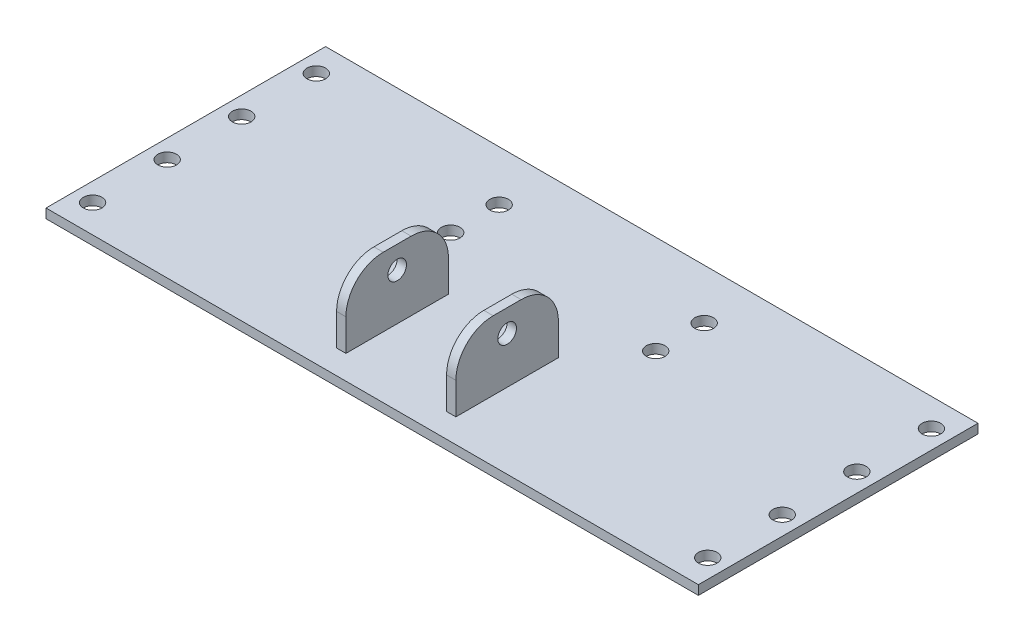
ISO-10303-21;
HEADER;
FILE_DESCRIPTION(('STEP AP214'),'2;1');
FILE_NAME('part.step','',(''),(''),'','','');
FILE_SCHEMA(('AUTOMOTIVE_DESIGN { 1 0 10303 214 1 1 1 1 }'));
ENDSEC;
DATA;
#1=APPLICATION_CONTEXT('core data for automotive mechanical design processes');
#2=APPLICATION_PROTOCOL_DEFINITION('international standard','automotive_design',2000,#1);
#3=PRODUCT_CONTEXT('',#1,'mechanical');
#4=PRODUCT('Part','Part','',(#3));
#5=PRODUCT_RELATED_PRODUCT_CATEGORY('part','',(#4));
#6=PRODUCT_DEFINITION_FORMATION('','',#4);
#7=PRODUCT_DEFINITION_CONTEXT('part definition',#1,'design');
#8=PRODUCT_DEFINITION('design','',#6,#7);
#9=PRODUCT_DEFINITION_SHAPE('','',#8);
#10=(LENGTH_UNIT() NAMED_UNIT(*) SI_UNIT(.MILLI.,.METRE.));
#11=(NAMED_UNIT(*) PLANE_ANGLE_UNIT() SI_UNIT($,.RADIAN.));
#12=(NAMED_UNIT(*) SI_UNIT($,.STERADIAN.) SOLID_ANGLE_UNIT());
#13=UNCERTAINTY_MEASURE_WITH_UNIT(LENGTH_MEASURE(1.E-05),#10,'distance_accuracy_value','');
#14=(GEOMETRIC_REPRESENTATION_CONTEXT(3) GLOBAL_UNCERTAINTY_ASSIGNED_CONTEXT((#13)) GLOBAL_UNIT_ASSIGNED_CONTEXT((#10,
#11,#12)) REPRESENTATION_CONTEXT('',''));
#15=CARTESIAN_POINT('',(0.,0.,0.));
#16=DIRECTION('',(0.,0.,1.));
#17=DIRECTION('',(1.,0.,0.));
#18=AXIS2_PLACEMENT_3D('',#15,#16,#17);
#19=CARTESIAN_POINT('',(0.,5.,0.));
#20=DIRECTION('',(0.,-1.,0.));
#21=DIRECTION('',(0.,0.,-1.));
#22=AXIS2_PLACEMENT_3D('',#19,#20,#21);
#23=PLANE('',#22);
#24=CARTESIAN_POINT('',(165.,5.,-60.));
#25=DIRECTION('',(0.,-1.,0.));
#26=DIRECTION('',(0.,0.,1.));
#27=AXIS2_PLACEMENT_3D('',#24,#25,#26);
#28=CIRCLE('',#27,5.00000000000002);
#29=CARTESIAN_POINT('',(165.,5.,-55.));
#30=VERTEX_POINT('',#29);
#31=EDGE_CURVE('E437',#30,#30,#28,.T.);
#32=ORIENTED_EDGE('',*,*,#31,.T.);
#33=EDGE_LOOP('',(#32));
#34=FACE_BOUND('',#33,.T.);
#35=CARTESIAN_POINT('',(165.,5.,-20.));
#36=DIRECTION('',(0.,-1.,0.));
#37=DIRECTION('',(0.,0.,1.));
#38=AXIS2_PLACEMENT_3D('',#35,#36,#37);
#39=CIRCLE('',#38,4.99999999999999);
#40=CARTESIAN_POINT('',(165.,5.,-15.0000000000001));
#41=VERTEX_POINT('',#40);
#42=EDGE_CURVE('E429',#41,#41,#39,.T.);
#43=ORIENTED_EDGE('',*,*,#42,.T.);
#44=EDGE_LOOP('',(#43));
#45=FACE_BOUND('',#44,.T.);
#46=CARTESIAN_POINT('',(165.,5.,20.));
#47=DIRECTION('',(0.,-1.,0.));
#48=DIRECTION('',(0.,0.,1.));
#49=AXIS2_PLACEMENT_3D('',#46,#47,#48);
#50=CIRCLE('',#49,4.99999999999999);
#51=CARTESIAN_POINT('',(165.,5.,25.));
#52=VERTEX_POINT('',#51);
#53=EDGE_CURVE('E421',#52,#52,#50,.T.);
#54=ORIENTED_EDGE('',*,*,#53,.T.);
#55=EDGE_LOOP('',(#54));
#56=FACE_BOUND('',#55,.T.);
#57=CARTESIAN_POINT('',(165.,5.,60.));
#58=DIRECTION('',(0.,-1.,0.));
#59=DIRECTION('',(0.,0.,1.));
#60=AXIS2_PLACEMENT_3D('',#57,#58,#59);
#61=CIRCLE('',#60,5.00000000000002);
#62=CARTESIAN_POINT('',(165.,5.,65.));
#63=VERTEX_POINT('',#62);
#64=EDGE_CURVE('E413',#63,#63,#61,.T.);
#65=ORIENTED_EDGE('',*,*,#64,.T.);
#66=EDGE_LOOP('',(#65));
#67=FACE_BOUND('',#66,.T.);
#68=CARTESIAN_POINT('',(-165.,5.,-60.));
#69=DIRECTION('',(0.,1.,0.));
#70=DIRECTION('',(0.,0.,1.));
#71=AXIS2_PLACEMENT_3D('',#68,#69,#70);
#72=CIRCLE('',#71,5.00000000000002);
#73=CARTESIAN_POINT('',(-165.,5.,-55.));
#74=VERTEX_POINT('',#73);
#75=EDGE_CURVE('E406',#74,#74,#72,.T.);
#76=ORIENTED_EDGE('',*,*,#75,.F.);
#77=EDGE_LOOP('',(#76));
#78=FACE_BOUND('',#77,.T.);
#79=CARTESIAN_POINT('',(-165.,5.,-20.));
#80=DIRECTION('',(0.,1.,0.));
#81=DIRECTION('',(0.,0.,1.));
#82=AXIS2_PLACEMENT_3D('',#79,#80,#81);
#83=CIRCLE('',#82,4.99999999999999);
#84=CARTESIAN_POINT('',(-165.,5.,-15.0000000000001));
#85=VERTEX_POINT('',#84);
#86=EDGE_CURVE('E398',#85,#85,#83,.T.);
#87=ORIENTED_EDGE('',*,*,#86,.F.);
#88=EDGE_LOOP('',(#87));
#89=FACE_BOUND('',#88,.T.);
#90=CARTESIAN_POINT('',(-165.,5.,20.));
#91=DIRECTION('',(0.,1.,0.));
#92=DIRECTION('',(0.,0.,1.));
#93=AXIS2_PLACEMENT_3D('',#90,#91,#92);
#94=CIRCLE('',#93,4.99999999999999);
#95=CARTESIAN_POINT('',(-165.,5.,25.));
#96=VERTEX_POINT('',#95);
#97=EDGE_CURVE('E390',#96,#96,#94,.T.);
#98=ORIENTED_EDGE('',*,*,#97,.F.);
#99=EDGE_LOOP('',(#98));
#100=FACE_BOUND('',#99,.T.);
#101=CARTESIAN_POINT('',(-165.,5.,60.));
#102=DIRECTION('',(0.,1.,0.));
#103=DIRECTION('',(0.,0.,1.));
#104=AXIS2_PLACEMENT_3D('',#101,#102,#103);
#105=CIRCLE('',#104,5.00000000000002);
#106=CARTESIAN_POINT('',(-165.,5.,65.));
#107=VERTEX_POINT('',#106);
#108=EDGE_CURVE('E381',#107,#107,#105,.T.);
#109=ORIENTED_EDGE('',*,*,#108,.F.);
#110=EDGE_LOOP('',(#109));
#111=FACE_BOUND('',#110,.T.);
#112=CARTESIAN_POINT('',(55.,5.,-48.1));
#113=DIRECTION('',(0.,-1.,0.));
#114=DIRECTION('',(0.,0.,1.));
#115=AXIS2_PLACEMENT_3D('',#112,#113,#114);
#116=CIRCLE('',#115,5.);
#117=CARTESIAN_POINT('',(55.,5.,-43.1));
#118=VERTEX_POINT('',#117);
#119=EDGE_CURVE('E374',#118,#118,#116,.T.);
#120=ORIENTED_EDGE('',*,*,#119,.T.);
#121=EDGE_LOOP('',(#120));
#122=FACE_BOUND('',#121,.T.);
#123=CARTESIAN_POINT('',(55.,5.,-22.1));
#124=DIRECTION('',(0.,-1.,0.));
#125=DIRECTION('',(0.,0.,1.));
#126=AXIS2_PLACEMENT_3D('',#123,#124,#125);
#127=CIRCLE('',#126,5.);
#128=CARTESIAN_POINT('',(55.,5.,-17.1));
#129=VERTEX_POINT('',#128);
#130=EDGE_CURVE('E365',#129,#129,#127,.T.);
#131=ORIENTED_EDGE('',*,*,#130,.T.);
#132=EDGE_LOOP('',(#131));
#133=FACE_BOUND('',#132,.T.);
#134=CARTESIAN_POINT('',(-55.,5.,-48.1));
#135=DIRECTION('',(0.,1.,0.));
#136=DIRECTION('',(0.,0.,1.));
#137=AXIS2_PLACEMENT_3D('',#134,#135,#136);
#138=CIRCLE('',#137,5.);
#139=CARTESIAN_POINT('',(-55.,5.,-43.1));
#140=VERTEX_POINT('',#139);
#141=EDGE_CURVE('E358',#140,#140,#138,.T.);
#142=ORIENTED_EDGE('',*,*,#141,.F.);
#143=EDGE_LOOP('',(#142));
#144=FACE_BOUND('',#143,.T.);
#145=CARTESIAN_POINT('',(-55.,5.,-22.1));
#146=DIRECTION('',(0.,1.,0.));
#147=DIRECTION('',(0.,0.,1.));
#148=AXIS2_PLACEMENT_3D('',#145,#146,#147);
#149=CIRCLE('',#148,5.);
#150=CARTESIAN_POINT('',(-55.,5.,-17.1));
#151=VERTEX_POINT('',#150);
#152=EDGE_CURVE('E349',#151,#151,#149,.T.);
#153=ORIENTED_EDGE('',*,*,#152,.F.);
#154=EDGE_LOOP('',(#153));
#155=FACE_BOUND('',#154,.T.);
#156=DIRECTION('',(0.,0.,-1.));
#157=VECTOR('',#156,1.);
#158=CARTESIAN_POINT('',(32.,5.,0.));
#159=LINE('',#158,#157);
#160=CARTESIAN_POINT('',(32.,5.,62.1));
#161=VERTEX_POINT('',#160);
#162=CARTESIAN_POINT('',(32.,5.,7.09999999999997));
#163=VERTEX_POINT('',#162);
#164=EDGE_CURVE('E219',#161,#163,#159,.T.);
#165=ORIENTED_EDGE('',*,*,#164,.F.);
#166=DIRECTION('',(1.,0.,0.));
#167=VECTOR('',#166,1.);
#168=CARTESIAN_POINT('',(0.,5.,62.1));
#169=LINE('',#168,#167);
#170=CARTESIAN_POINT('',(27.,5.,62.1));
#171=VERTEX_POINT('',#170);
#172=EDGE_CURVE('E226',#171,#161,#169,.T.);
#173=ORIENTED_EDGE('',*,*,#172,.F.);
#174=DIRECTION('',(0.,0.,-1.));
#175=VECTOR('',#174,1.);
#176=CARTESIAN_POINT('',(27.,5.,0.));
#177=LINE('',#176,#175);
#178=CARTESIAN_POINT('',(27.,5.,7.09999999999997));
#179=VERTEX_POINT('',#178);
#180=EDGE_CURVE('E205',#171,#179,#177,.T.);
#181=ORIENTED_EDGE('',*,*,#180,.T.);
#182=DIRECTION('',(-1.,0.,0.));
#183=VECTOR('',#182,1.);
#184=CARTESIAN_POINT('',(0.,5.,7.09999999999997));
#185=LINE('',#184,#183);
#186=EDGE_CURVE('E222',#163,#179,#185,.T.);
#187=ORIENTED_EDGE('',*,*,#186,.F.);
#188=EDGE_LOOP('',(#165,#173,#181,#187));
#189=FACE_BOUND('',#188,.T.);
#190=DIRECTION('',(0.,0.,1.));
#191=VECTOR('',#190,1.);
#192=CARTESIAN_POINT('',(-175.,5.,-75.));
#193=LINE('',#192,#191);
#194=CARTESIAN_POINT('',(-175.,5.,-75.));
#195=VERTEX_POINT('',#194);
#196=CARTESIAN_POINT('',(-175.,5.,75.));
#197=VERTEX_POINT('',#196);
#198=EDGE_CURVE('E231',#195,#197,#193,.T.);
#199=ORIENTED_EDGE('',*,*,#198,.T.);
#200=DIRECTION('',(1.,0.,0.));
#201=VECTOR('',#200,1.);
#202=CARTESIAN_POINT('',(175.,5.,75.));
#203=LINE('',#202,#201);
#204=CARTESIAN_POINT('',(175.,5.,75.));
#205=VERTEX_POINT('',#204);
#206=EDGE_CURVE('E235',#197,#205,#203,.T.);
#207=ORIENTED_EDGE('',*,*,#206,.T.);
#208=DIRECTION('',(0.,0.,-1.));
#209=VECTOR('',#208,1.);
#210=CARTESIAN_POINT('',(175.,5.,-75.));
#211=LINE('',#210,#209);
#212=CARTESIAN_POINT('',(175.,5.,-75.));
#213=VERTEX_POINT('',#212);
#214=EDGE_CURVE('E239',#205,#213,#211,.T.);
#215=ORIENTED_EDGE('',*,*,#214,.T.);
#216=DIRECTION('',(-1.,0.,0.));
#217=VECTOR('',#216,1.);
#218=CARTESIAN_POINT('',(175.,5.,-75.));
#219=LINE('',#218,#217);
#220=EDGE_CURVE('E242',#213,#195,#219,.T.);
#221=ORIENTED_EDGE('',*,*,#220,.T.);
#222=EDGE_LOOP('',(#199,#207,#215,#221));
#223=FACE_BOUND('',#222,.T.);
#224=DIRECTION('',(0.,0.,1.));
#225=VECTOR('',#224,1.);
#226=CARTESIAN_POINT('',(-32.,5.,0.));
#227=LINE('',#226,#225);
#228=CARTESIAN_POINT('',(-32.,5.,7.09999999999997));
#229=VERTEX_POINT('',#228);
#230=CARTESIAN_POINT('',(-32.,5.,62.1));
#231=VERTEX_POINT('',#230);
#232=EDGE_CURVE('E163',#229,#231,#227,.T.);
#233=ORIENTED_EDGE('',*,*,#232,.F.);
#234=DIRECTION('',(1.,0.,0.));
#235=VECTOR('',#234,1.);
#236=CARTESIAN_POINT('',(0.,5.,7.09999999999997));
#237=LINE('',#236,#235);
#238=CARTESIAN_POINT('',(-27.,5.,7.09999999999997));
#239=VERTEX_POINT('',#238);
#240=EDGE_CURVE('E170',#229,#239,#237,.T.);
#241=ORIENTED_EDGE('',*,*,#240,.T.);
#242=DIRECTION('',(0.,0.,1.));
#243=VECTOR('',#242,1.);
#244=CARTESIAN_POINT('',(-27.,5.,0.));
#245=LINE('',#244,#243);
#246=CARTESIAN_POINT('',(-27.,5.,62.1));
#247=VERTEX_POINT('',#246);
#248=EDGE_CURVE('E153',#239,#247,#245,.T.);
#249=ORIENTED_EDGE('',*,*,#248,.T.);
#250=DIRECTION('',(-1.,0.,0.));
#251=VECTOR('',#250,1.);
#252=CARTESIAN_POINT('',(0.,5.,62.1));
#253=LINE('',#252,#251);
#254=EDGE_CURVE('E181',#247,#231,#253,.T.);
#255=ORIENTED_EDGE('',*,*,#254,.T.);
#256=EDGE_LOOP('',(#233,#241,#249,#255));
#257=FACE_BOUND('',#256,.T.);
#258=ADVANCED_FACE('F39',(#34,#45,#56,#67,#78,#89,#100,#111,#122,#133,#144,#155,#189,#223,#257),
#23,.F.);
#259=CARTESIAN_POINT('',(-175.,5.,-75.));
#260=DIRECTION('',(1.,0.,0.));
#261=DIRECTION('',(0.,0.,-1.));
#262=AXIS2_PLACEMENT_3D('',#259,#260,#261);
#263=PLANE('',#262);
#264=DIRECTION('',(0.,0.,1.));
#265=VECTOR('',#264,1.);
#266=CARTESIAN_POINT('',(-175.,0.,-75.));
#267=LINE('',#266,#265);
#268=CARTESIAN_POINT('',(-175.,0.,-75.));
#269=VERTEX_POINT('',#268);
#270=CARTESIAN_POINT('',(-175.,0.,75.));
#271=VERTEX_POINT('',#270);
#272=EDGE_CURVE('E230',#269,#271,#267,.T.);
#273=ORIENTED_EDGE('',*,*,#272,.T.);
#274=DIRECTION('',(0.,-1.,0.));
#275=VECTOR('',#274,1.);
#276=CARTESIAN_POINT('',(-175.,5.,75.));
#277=LINE('',#276,#275);
#278=EDGE_CURVE('E268',#197,#271,#277,.T.);
#279=ORIENTED_EDGE('',*,*,#278,.F.);
#280=ORIENTED_EDGE('',*,*,#198,.F.);
#281=DIRECTION('',(0.,-1.,0.));
#282=VECTOR('',#281,1.);
#283=CARTESIAN_POINT('',(-175.,5.,-75.));
#284=LINE('',#283,#282);
#285=EDGE_CURVE('E245',#195,#269,#284,.T.);
#286=ORIENTED_EDGE('',*,*,#285,.T.);
#287=EDGE_LOOP('',(#273,#279,#280,#286));
#288=FACE_BOUND('',#287,.T.);
#289=ADVANCED_FACE('F481',(#288),#263,.F.);
#290=CARTESIAN_POINT('',(175.,5.,75.));
#291=DIRECTION('',(0.,0.,-1.));
#292=DIRECTION('',(-1.,0.,0.));
#293=AXIS2_PLACEMENT_3D('',#290,#291,#292);
#294=PLANE('',#293);
#295=DIRECTION('',(1.,0.,0.));
#296=VECTOR('',#295,1.);
#297=CARTESIAN_POINT('',(175.,0.,75.));
#298=LINE('',#297,#296);
#299=CARTESIAN_POINT('',(175.,0.,75.));
#300=VERTEX_POINT('',#299);
#301=EDGE_CURVE('E249',#271,#300,#298,.T.);
#302=ORIENTED_EDGE('',*,*,#301,.T.);
#303=DIRECTION('',(0.,-1.,0.));
#304=VECTOR('',#303,1.);
#305=CARTESIAN_POINT('',(175.,5.,75.));
#306=LINE('',#305,#304);
#307=EDGE_CURVE('E264',#205,#300,#306,.T.);
#308=ORIENTED_EDGE('',*,*,#307,.F.);
#309=ORIENTED_EDGE('',*,*,#206,.F.);
#310=ORIENTED_EDGE('',*,*,#278,.T.);
#311=EDGE_LOOP('',(#302,#308,#309,#310));
#312=FACE_BOUND('',#311,.T.);
#313=ADVANCED_FACE('F492',(#312),#294,.F.);
#314=CARTESIAN_POINT('',(175.,5.,-75.));
#315=DIRECTION('',(-1.,0.,0.));
#316=DIRECTION('',(0.,0.,1.));
#317=AXIS2_PLACEMENT_3D('',#314,#315,#316);
#318=PLANE('',#317);
#319=DIRECTION('',(0.,0.,-1.));
#320=VECTOR('',#319,1.);
#321=CARTESIAN_POINT('',(175.,0.,-75.));
#322=LINE('',#321,#320);
#323=CARTESIAN_POINT('',(175.,0.,-75.));
#324=VERTEX_POINT('',#323);
#325=EDGE_CURVE('E252',#300,#324,#322,.T.);
#326=ORIENTED_EDGE('',*,*,#325,.T.);
#327=DIRECTION('',(0.,-1.,0.));
#328=VECTOR('',#327,1.);
#329=CARTESIAN_POINT('',(175.,5.,-75.));
#330=LINE('',#329,#328);
#331=EDGE_CURVE('E260',#213,#324,#330,.T.);
#332=ORIENTED_EDGE('',*,*,#331,.F.);
#333=ORIENTED_EDGE('',*,*,#214,.F.);
#334=ORIENTED_EDGE('',*,*,#307,.T.);
#335=EDGE_LOOP('',(#326,#332,#333,#334));
#336=FACE_BOUND('',#335,.T.);
#337=ADVANCED_FACE('F489',(#336),#318,.F.);
#338=CARTESIAN_POINT('',(175.,5.,-75.));
#339=DIRECTION('',(0.,0.,1.));
#340=DIRECTION('',(1.,0.,0.));
#341=AXIS2_PLACEMENT_3D('',#338,#339,#340);
#342=PLANE('',#341);
#343=DIRECTION('',(-1.,0.,0.));
#344=VECTOR('',#343,1.);
#345=CARTESIAN_POINT('',(175.,0.,-75.));
#346=LINE('',#345,#344);
#347=EDGE_CURVE('E236',#324,#269,#346,.T.);
#348=ORIENTED_EDGE('',*,*,#347,.T.);
#349=ORIENTED_EDGE('',*,*,#285,.F.);
#350=ORIENTED_EDGE('',*,*,#220,.F.);
#351=ORIENTED_EDGE('',*,*,#331,.T.);
#352=EDGE_LOOP('',(#348,#349,#350,#351));
#353=FACE_BOUND('',#352,.T.);
#354=ADVANCED_FACE('F452',(#353),#342,.F.);
#355=CARTESIAN_POINT('',(0.,0.,0.));
#356=DIRECTION('',(0.,-1.,0.));
#357=DIRECTION('',(0.,0.,-1.));
#358=AXIS2_PLACEMENT_3D('',#355,#356,#357);
#359=PLANE('',#358);
#360=CARTESIAN_POINT('',(165.,0.,-60.));
#361=DIRECTION('',(0.,-1.,0.));
#362=DIRECTION('',(0.,0.,1.));
#363=AXIS2_PLACEMENT_3D('',#360,#361,#362);
#364=CIRCLE('',#363,5.00000000000002);
#365=CARTESIAN_POINT('',(165.,0.,-55.));
#366=VERTEX_POINT('',#365);
#367=EDGE_CURVE('E386',#366,#366,#364,.T.);
#368=ORIENTED_EDGE('',*,*,#367,.F.);
#369=EDGE_LOOP('',(#368));
#370=FACE_BOUND('',#369,.T.);
#371=CARTESIAN_POINT('',(165.,0.,-20.));
#372=DIRECTION('',(0.,-1.,0.));
#373=DIRECTION('',(0.,0.,1.));
#374=AXIS2_PLACEMENT_3D('',#371,#372,#373);
#375=CIRCLE('',#374,4.99999999999999);
#376=CARTESIAN_POINT('',(165.,0.,-15.0000000000001));
#377=VERTEX_POINT('',#376);
#378=EDGE_CURVE('E433',#377,#377,#375,.T.);
#379=ORIENTED_EDGE('',*,*,#378,.F.);
#380=EDGE_LOOP('',(#379));
#381=FACE_BOUND('',#380,.T.);
#382=CARTESIAN_POINT('',(165.,0.,20.));
#383=DIRECTION('',(0.,-1.,0.));
#384=DIRECTION('',(0.,0.,1.));
#385=AXIS2_PLACEMENT_3D('',#382,#383,#384);
#386=CIRCLE('',#385,4.99999999999999);
#387=CARTESIAN_POINT('',(165.,0.,25.));
#388=VERTEX_POINT('',#387);
#389=EDGE_CURVE('E425',#388,#388,#386,.T.);
#390=ORIENTED_EDGE('',*,*,#389,.F.);
#391=EDGE_LOOP('',(#390));
#392=FACE_BOUND('',#391,.T.);
#393=CARTESIAN_POINT('',(165.,0.,60.));
#394=DIRECTION('',(0.,-1.,0.));
#395=DIRECTION('',(0.,0.,1.));
#396=AXIS2_PLACEMENT_3D('',#393,#394,#395);
#397=CIRCLE('',#396,5.00000000000002);
#398=CARTESIAN_POINT('',(165.,0.,65.));
#399=VERTEX_POINT('',#398);
#400=EDGE_CURVE('E417',#399,#399,#397,.T.);
#401=ORIENTED_EDGE('',*,*,#400,.F.);
#402=EDGE_LOOP('',(#401));
#403=FACE_BOUND('',#402,.T.);
#404=CARTESIAN_POINT('',(-165.,0.,-60.));
#405=DIRECTION('',(0.,1.,0.));
#406=DIRECTION('',(0.,0.,1.));
#407=AXIS2_PLACEMENT_3D('',#404,#405,#406);
#408=CIRCLE('',#407,5.00000000000002);
#409=CARTESIAN_POINT('',(-165.,0.,-55.));
#410=VERTEX_POINT('',#409);
#411=EDGE_CURVE('E370',#410,#410,#408,.T.);
#412=ORIENTED_EDGE('',*,*,#411,.T.);
#413=EDGE_LOOP('',(#412));
#414=FACE_BOUND('',#413,.T.);
#415=CARTESIAN_POINT('',(-165.,0.,-20.));
#416=DIRECTION('',(0.,1.,0.));
#417=DIRECTION('',(0.,0.,1.));
#418=AXIS2_PLACEMENT_3D('',#415,#416,#417);
#419=CIRCLE('',#418,4.99999999999999);
#420=CARTESIAN_POINT('',(-165.,0.,-15.0000000000001));
#421=VERTEX_POINT('',#420);
#422=EDGE_CURVE('E402',#421,#421,#419,.T.);
#423=ORIENTED_EDGE('',*,*,#422,.T.);
#424=EDGE_LOOP('',(#423));
#425=FACE_BOUND('',#424,.T.);
#426=CARTESIAN_POINT('',(-165.,0.,20.));
#427=DIRECTION('',(0.,1.,0.));
#428=DIRECTION('',(0.,0.,1.));
#429=AXIS2_PLACEMENT_3D('',#426,#427,#428);
#430=CIRCLE('',#429,4.99999999999999);
#431=CARTESIAN_POINT('',(-165.,0.,25.));
#432=VERTEX_POINT('',#431);
#433=EDGE_CURVE('E394',#432,#432,#430,.T.);
#434=ORIENTED_EDGE('',*,*,#433,.T.);
#435=EDGE_LOOP('',(#434));
#436=FACE_BOUND('',#435,.T.);
#437=CARTESIAN_POINT('',(-165.,0.,60.));
#438=DIRECTION('',(0.,1.,0.));
#439=DIRECTION('',(0.,0.,1.));
#440=AXIS2_PLACEMENT_3D('',#437,#438,#439);
#441=CIRCLE('',#440,5.00000000000002);
#442=CARTESIAN_POINT('',(-165.,0.,65.));
#443=VERTEX_POINT('',#442);
#444=EDGE_CURVE('E385',#443,#443,#441,.T.);
#445=ORIENTED_EDGE('',*,*,#444,.T.);
#446=EDGE_LOOP('',(#445));
#447=FACE_BOUND('',#446,.T.);
#448=CARTESIAN_POINT('',(55.,0.,-48.1));
#449=DIRECTION('',(0.,-1.,0.));
#450=DIRECTION('',(0.,0.,1.));
#451=AXIS2_PLACEMENT_3D('',#448,#449,#450);
#452=CIRCLE('',#451,5.);
#453=CARTESIAN_POINT('',(55.,0.,-43.1));
#454=VERTEX_POINT('',#453);
#455=EDGE_CURVE('E354',#454,#454,#452,.T.);
#456=ORIENTED_EDGE('',*,*,#455,.F.);
#457=EDGE_LOOP('',(#456));
#458=FACE_BOUND('',#457,.T.);
#459=CARTESIAN_POINT('',(55.,0.,-22.1));
#460=DIRECTION('',(0.,-1.,0.));
#461=DIRECTION('',(0.,0.,1.));
#462=AXIS2_PLACEMENT_3D('',#459,#460,#461);
#463=CIRCLE('',#462,5.);
#464=CARTESIAN_POINT('',(55.,0.,-17.1));
#465=VERTEX_POINT('',#464);
#466=EDGE_CURVE('E369',#465,#465,#463,.T.);
#467=ORIENTED_EDGE('',*,*,#466,.F.);
#468=EDGE_LOOP('',(#467));
#469=FACE_BOUND('',#468,.T.);
#470=CARTESIAN_POINT('',(-55.,0.,-48.1));
#471=DIRECTION('',(0.,1.,0.));
#472=DIRECTION('',(0.,0.,1.));
#473=AXIS2_PLACEMENT_3D('',#470,#471,#472);
#474=CIRCLE('',#473,5.);
#475=CARTESIAN_POINT('',(-55.,0.,-43.1));
#476=VERTEX_POINT('',#475);
#477=EDGE_CURVE('E348',#476,#476,#474,.T.);
#478=ORIENTED_EDGE('',*,*,#477,.T.);
#479=EDGE_LOOP('',(#478));
#480=FACE_BOUND('',#479,.T.);
#481=CARTESIAN_POINT('',(-55.,0.,-22.1));
#482=DIRECTION('',(0.,1.,0.));
#483=DIRECTION('',(0.,0.,1.));
#484=AXIS2_PLACEMENT_3D('',#481,#482,#483);
#485=CIRCLE('',#484,5.);
#486=CARTESIAN_POINT('',(-55.,0.,-17.1));
#487=VERTEX_POINT('',#486);
#488=EDGE_CURVE('E353',#487,#487,#485,.T.);
#489=ORIENTED_EDGE('',*,*,#488,.T.);
#490=EDGE_LOOP('',(#489));
#491=FACE_BOUND('',#490,.T.);
#492=ORIENTED_EDGE('',*,*,#272,.F.);
#493=ORIENTED_EDGE('',*,*,#347,.F.);
#494=ORIENTED_EDGE('',*,*,#325,.F.);
#495=ORIENTED_EDGE('',*,*,#301,.F.);
#496=EDGE_LOOP('',(#492,#493,#494,#495));
#497=FACE_BOUND('',#496,.T.);
#498=ADVANCED_FACE('F448',(#370,#381,#392,#403,#414,#425,#436,#447,#458,#469,#480,#491,#497),
#359,.T.);
#499=CARTESIAN_POINT('',(32.,0.,62.1));
#500=DIRECTION('',(0.,0.,-1.));
#501=DIRECTION('',(0.,1.,0.));
#502=AXIS2_PLACEMENT_3D('',#499,#500,#501);
#503=PLANE('',#502);
#504=DIRECTION('',(0.,-1.,0.));
#505=VECTOR('',#504,1.);
#506=CARTESIAN_POINT('',(32.,0.,62.1));
#507=LINE('',#506,#505);
#508=CARTESIAN_POINT('',(32.,22.,62.1));
#509=VERTEX_POINT('',#508);
#510=EDGE_CURVE('E193',#509,#161,#507,.T.);
#511=ORIENTED_EDGE('',*,*,#510,.F.);
#512=DIRECTION('',(-1.,0.,0.));
#513=VECTOR('',#512,1.);
#514=CARTESIAN_POINT('',(32.,22.,62.1));
#515=LINE('',#514,#513);
#516=CARTESIAN_POINT('',(27.,22.,62.1));
#517=VERTEX_POINT('',#516);
#518=EDGE_CURVE('E297',#509,#517,#515,.T.);
#519=ORIENTED_EDGE('',*,*,#518,.T.);
#520=DIRECTION('',(0.,-1.,0.));
#521=VECTOR('',#520,1.);
#522=CARTESIAN_POINT('',(27.,0.,62.1));
#523=LINE('',#522,#521);
#524=EDGE_CURVE('E206',#517,#171,#523,.T.);
#525=ORIENTED_EDGE('',*,*,#524,.T.);
#526=ORIENTED_EDGE('',*,*,#172,.T.);
#527=EDGE_LOOP('',(#511,#519,#525,#526));
#528=FACE_BOUND('',#527,.T.);
#529=ADVANCED_FACE('F451',(#528),#503,.F.);
#530=CARTESIAN_POINT('',(32.,0.,7.09999999999997));
#531=DIRECTION('',(0.,0.,1.));
#532=DIRECTION('',(1.,0.,0.));
#533=AXIS2_PLACEMENT_3D('',#530,#531,#532);
#534=PLANE('',#533);
#535=DIRECTION('',(0.,1.,0.));
#536=VECTOR('',#535,1.);
#537=CARTESIAN_POINT('',(27.,0.,7.09999999999997));
#538=LINE('',#537,#536);
#539=CARTESIAN_POINT('',(27.,22.,7.09999999999997));
#540=VERTEX_POINT('',#539);
#541=EDGE_CURVE('E209',#179,#540,#538,.T.);
#542=ORIENTED_EDGE('',*,*,#541,.T.);
#543=DIRECTION('',(-1.,0.,0.));
#544=VECTOR('',#543,1.);
#545=CARTESIAN_POINT('',(32.,22.,7.09999999999997));
#546=LINE('',#545,#544);
#547=CARTESIAN_POINT('',(32.,22.,7.09999999999997));
#548=VERTEX_POINT('',#547);
#549=EDGE_CURVE('E288',#540,#548,#546,.F.);
#550=ORIENTED_EDGE('',*,*,#549,.T.);
#551=DIRECTION('',(0.,1.,0.));
#552=VECTOR('',#551,1.);
#553=CARTESIAN_POINT('',(32.,0.,7.09999999999997));
#554=LINE('',#553,#552);
#555=EDGE_CURVE('E196',#163,#548,#554,.T.);
#556=ORIENTED_EDGE('',*,*,#555,.F.);
#557=ORIENTED_EDGE('',*,*,#186,.T.);
#558=EDGE_LOOP('',(#542,#550,#556,#557));
#559=FACE_BOUND('',#558,.T.);
#560=ADVANCED_FACE('F557',(#559),#534,.F.);
#561=CARTESIAN_POINT('',(32.,0.,0.));
#562=DIRECTION('',(-1.,0.,0.));
#563=DIRECTION('',(0.,0.,1.));
#564=AXIS2_PLACEMENT_3D('',#561,#562,#563);
#565=PLANE('',#564);
#566=CARTESIAN_POINT('',(32.,30.,34.6));
#567=DIRECTION('',(1.,0.,0.));
#568=DIRECTION('',(0.,0.,-1.));
#569=AXIS2_PLACEMENT_3D('',#566,#567,#568);
#570=CIRCLE('',#569,5.);
#571=CARTESIAN_POINT('',(32.,30.,29.6));
#572=VERTEX_POINT('',#571);
#573=EDGE_CURVE('E185',#572,#572,#570,.T.);
#574=ORIENTED_EDGE('',*,*,#573,.F.);
#575=EDGE_LOOP('',(#574));
#576=FACE_BOUND('',#575,.T.);
#577=ORIENTED_EDGE('',*,*,#555,.T.);
#578=CARTESIAN_POINT('',(32.,22.,27.1));
#579=DIRECTION('',(-1.,0.,0.));
#580=DIRECTION('',(0.,0.,1.));
#581=AXIS2_PLACEMENT_3D('',#578,#579,#580);
#582=CIRCLE('',#581,20.);
#583=CARTESIAN_POINT('',(32.,42.,27.1));
#584=VERTEX_POINT('',#583);
#585=EDGE_CURVE('E294',#548,#584,#582,.F.);
#586=ORIENTED_EDGE('',*,*,#585,.T.);
#587=DIRECTION('',(0.,0.,1.));
#588=VECTOR('',#587,1.);
#589=CARTESIAN_POINT('',(32.,42.,62.1));
#590=LINE('',#589,#588);
#591=CARTESIAN_POINT('',(32.,42.,42.1));
#592=VERTEX_POINT('',#591);
#593=EDGE_CURVE('E201',#584,#592,#590,.T.);
#594=ORIENTED_EDGE('',*,*,#593,.T.);
#595=CARTESIAN_POINT('',(32.,22.,42.1));
#596=DIRECTION('',(-1.,0.,0.));
#597=DIRECTION('',(0.,0.,1.));
#598=AXIS2_PLACEMENT_3D('',#595,#596,#597);
#599=CIRCLE('',#598,20.);
#600=EDGE_CURVE('E291',#592,#509,#599,.F.);
#601=ORIENTED_EDGE('',*,*,#600,.T.);
#602=ORIENTED_EDGE('',*,*,#510,.T.);
#603=ORIENTED_EDGE('',*,*,#164,.T.);
#604=EDGE_LOOP('',(#577,#586,#594,#601,#602,#603));
#605=FACE_BOUND('',#604,.T.);
#606=ADVANCED_FACE('F553',(#576,#605),#565,.F.);
#607=CARTESIAN_POINT('',(27.,0.,0.));
#608=DIRECTION('',(-1.,0.,0.));
#609=DIRECTION('',(0.,0.,1.));
#610=AXIS2_PLACEMENT_3D('',#607,#608,#609);
#611=PLANE('',#610);
#612=CARTESIAN_POINT('',(27.,30.,34.6));
#613=DIRECTION('',(-1.,0.,0.));
#614=DIRECTION('',(0.,0.,1.));
#615=AXIS2_PLACEMENT_3D('',#612,#613,#614);
#616=CIRCLE('',#615,5.);
#617=CARTESIAN_POINT('',(27.,30.,39.6));
#618=VERTEX_POINT('',#617);
#619=EDGE_CURVE('E192',#618,#618,#616,.T.);
#620=ORIENTED_EDGE('',*,*,#619,.F.);
#621=EDGE_LOOP('',(#620));
#622=FACE_BOUND('',#621,.T.);
#623=DIRECTION('',(0.,0.,1.));
#624=VECTOR('',#623,1.);
#625=CARTESIAN_POINT('',(27.,42.,62.1));
#626=LINE('',#625,#624);
#627=CARTESIAN_POINT('',(27.,42.,27.1));
#628=VERTEX_POINT('',#627);
#629=CARTESIAN_POINT('',(27.,42.,42.1));
#630=VERTEX_POINT('',#629);
#631=EDGE_CURVE('E197',#628,#630,#626,.T.);
#632=ORIENTED_EDGE('',*,*,#631,.F.);
#633=CARTESIAN_POINT('',(27.,22.,27.1));
#634=DIRECTION('',(-1.,0.,0.));
#635=DIRECTION('',(0.,0.,1.));
#636=AXIS2_PLACEMENT_3D('',#633,#634,#635);
#637=CIRCLE('',#636,20.);
#638=EDGE_CURVE('E285',#628,#540,#637,.T.);
#639=ORIENTED_EDGE('',*,*,#638,.T.);
#640=ORIENTED_EDGE('',*,*,#541,.F.);
#641=ORIENTED_EDGE('',*,*,#180,.F.);
#642=ORIENTED_EDGE('',*,*,#524,.F.);
#643=CARTESIAN_POINT('',(27.,22.,42.1));
#644=DIRECTION('',(-1.,0.,0.));
#645=DIRECTION('',(0.,0.,1.));
#646=AXIS2_PLACEMENT_3D('',#643,#644,#645);
#647=CIRCLE('',#646,20.);
#648=EDGE_CURVE('E282',#517,#630,#647,.T.);
#649=ORIENTED_EDGE('',*,*,#648,.T.);
#650=EDGE_LOOP('',(#632,#639,#640,#641,#642,#649));
#651=FACE_BOUND('',#650,.T.);
#652=ADVANCED_FACE('F556',(#622,#651),#611,.T.);
#653=CARTESIAN_POINT('',(32.,42.,62.1));
#654=DIRECTION('',(0.,-1.,0.));
#655=DIRECTION('',(0.,0.,-1.));
#656=AXIS2_PLACEMENT_3D('',#653,#654,#655);
#657=PLANE('',#656);
#658=ORIENTED_EDGE('',*,*,#593,.F.);
#659=DIRECTION('',(-1.,0.,0.));
#660=VECTOR('',#659,1.);
#661=CARTESIAN_POINT('',(32.,42.,27.1));
#662=LINE('',#661,#660);
#663=EDGE_CURVE('E278',#584,#628,#662,.T.);
#664=ORIENTED_EDGE('',*,*,#663,.T.);
#665=ORIENTED_EDGE('',*,*,#631,.T.);
#666=DIRECTION('',(-1.,0.,0.));
#667=VECTOR('',#666,1.);
#668=CARTESIAN_POINT('',(32.,42.,42.1));
#669=LINE('',#668,#667);
#670=EDGE_CURVE('E272',#630,#592,#669,.F.);
#671=ORIENTED_EDGE('',*,*,#670,.T.);
#672=EDGE_LOOP('',(#658,#664,#665,#671));
#673=FACE_BOUND('',#672,.T.);
#674=ADVANCED_FACE('F551',(#673),#657,.F.);
#675=CARTESIAN_POINT('',(-175.,30.,34.6));
#676=DIRECTION('',(1.,0.,0.));
#677=DIRECTION('',(0.,0.,-1.));
#678=AXIS2_PLACEMENT_3D('',#675,#676,#677);
#679=CYLINDRICAL_SURFACE('',#678,5.);
#680=ORIENTED_EDGE('',*,*,#619,.T.);
#681=EDGE_LOOP('',(#680));
#682=FACE_BOUND('',#681,.T.);
#683=ORIENTED_EDGE('',*,*,#573,.T.);
#684=EDGE_LOOP('',(#683));
#685=FACE_BOUND('',#684,.T.);
#686=ADVANCED_FACE('F515',(#682,#685),#679,.F.);
#687=CARTESIAN_POINT('',(32.,22.,27.1));
#688=DIRECTION('',(-1.,0.,0.));
#689=DIRECTION('',(0.,0.,1.));
#690=AXIS2_PLACEMENT_3D('',#687,#688,#689);
#691=CYLINDRICAL_SURFACE('',#690,20.);
#692=ORIENTED_EDGE('',*,*,#585,.F.);
#693=ORIENTED_EDGE('',*,*,#549,.F.);
#694=ORIENTED_EDGE('',*,*,#638,.F.);
#695=ORIENTED_EDGE('',*,*,#663,.F.);
#696=EDGE_LOOP('',(#692,#693,#694,#695));
#697=FACE_BOUND('',#696,.T.);
#698=ADVANCED_FACE('F511',(#697),#691,.T.);
#699=CARTESIAN_POINT('',(32.,22.,42.1));
#700=DIRECTION('',(-1.,0.,0.));
#701=DIRECTION('',(0.,0.,1.));
#702=AXIS2_PLACEMENT_3D('',#699,#700,#701);
#703=CYLINDRICAL_SURFACE('',#702,20.);
#704=ORIENTED_EDGE('',*,*,#600,.F.);
#705=ORIENTED_EDGE('',*,*,#670,.F.);
#706=ORIENTED_EDGE('',*,*,#648,.F.);
#707=ORIENTED_EDGE('',*,*,#518,.F.);
#708=EDGE_LOOP('',(#704,#705,#706,#707));
#709=FACE_BOUND('',#708,.T.);
#710=ADVANCED_FACE('F514',(#709),#703,.T.);
#711=CARTESIAN_POINT('',(-32.,0.,62.1));
#712=DIRECTION('',(0.,0.,1.));
#713=DIRECTION('',(0.,-1.,0.));
#714=AXIS2_PLACEMENT_3D('',#711,#712,#713);
#715=PLANE('',#714);
#716=DIRECTION('',(0.,-1.,0.));
#717=VECTOR('',#716,1.);
#718=CARTESIAN_POINT('',(-27.,0.,62.1));
#719=LINE('',#718,#717);
#720=CARTESIAN_POINT('',(-27.,22.,62.1));
#721=VERTEX_POINT('',#720);
#722=EDGE_CURVE('E157',#721,#247,#719,.T.);
#723=ORIENTED_EDGE('',*,*,#722,.F.);
#724=DIRECTION('',(1.,0.,0.));
#725=VECTOR('',#724,1.);
#726=CARTESIAN_POINT('',(-32.,22.,62.1));
#727=LINE('',#726,#725);
#728=CARTESIAN_POINT('',(-32.,22.,62.1));
#729=VERTEX_POINT('',#728);
#730=EDGE_CURVE('E11',#721,#729,#727,.F.);
#731=ORIENTED_EDGE('',*,*,#730,.T.);
#732=DIRECTION('',(0.,-1.,0.));
#733=VECTOR('',#732,1.);
#734=CARTESIAN_POINT('',(-32.,0.,62.1));
#735=LINE('',#734,#733);
#736=EDGE_CURVE('E175',#729,#231,#735,.T.);
#737=ORIENTED_EDGE('',*,*,#736,.T.);
#738=ORIENTED_EDGE('',*,*,#254,.F.);
#739=EDGE_LOOP('',(#723,#731,#737,#738));
#740=FACE_BOUND('',#739,.T.);
#741=ADVANCED_FACE('F518',(#740),#715,.T.);
#742=CARTESIAN_POINT('',(-32.,0.,7.09999999999997));
#743=DIRECTION('',(0.,0.,-1.));
#744=DIRECTION('',(-1.,0.,0.));
#745=AXIS2_PLACEMENT_3D('',#742,#743,#744);
#746=PLANE('',#745);
#747=DIRECTION('',(0.,1.,0.));
#748=VECTOR('',#747,1.);
#749=CARTESIAN_POINT('',(-32.,0.,7.09999999999997));
#750=LINE('',#749,#748);
#751=CARTESIAN_POINT('',(-32.,22.,7.09999999999997));
#752=VERTEX_POINT('',#751);
#753=EDGE_CURVE('E164',#229,#752,#750,.T.);
#754=ORIENTED_EDGE('',*,*,#753,.T.);
#755=DIRECTION('',(1.,0.,0.));
#756=VECTOR('',#755,1.);
#757=CARTESIAN_POINT('',(-32.,22.,7.09999999999997));
#758=LINE('',#757,#756);
#759=CARTESIAN_POINT('',(-27.,22.,7.09999999999997));
#760=VERTEX_POINT('',#759);
#761=EDGE_CURVE('E173',#752,#760,#758,.T.);
#762=ORIENTED_EDGE('',*,*,#761,.T.);
#763=DIRECTION('',(0.,1.,0.));
#764=VECTOR('',#763,1.);
#765=CARTESIAN_POINT('',(-27.,0.,7.09999999999997));
#766=LINE('',#765,#764);
#767=EDGE_CURVE('E156',#239,#760,#766,.T.);
#768=ORIENTED_EDGE('',*,*,#767,.F.);
#769=ORIENTED_EDGE('',*,*,#240,.F.);
#770=EDGE_LOOP('',(#754,#762,#768,#769));
#771=FACE_BOUND('',#770,.T.);
#772=ADVANCED_FACE('F169',(#771),#746,.T.);
#773=CARTESIAN_POINT('',(-32.,0.,0.));
#774=DIRECTION('',(1.,0.,0.));
#775=DIRECTION('',(0.,0.,1.));
#776=AXIS2_PLACEMENT_3D('',#773,#774,#775);
#777=PLANE('',#776);
#778=CARTESIAN_POINT('',(-32.,30.,34.6));
#779=DIRECTION('',(1.,0.,0.));
#780=DIRECTION('',(0.,0.,-1.));
#781=AXIS2_PLACEMENT_3D('',#778,#779,#780);
#782=CIRCLE('',#781,5.);
#783=CARTESIAN_POINT('',(-32.,30.,29.6));
#784=VERTEX_POINT('',#783);
#785=EDGE_CURVE('E305',#784,#784,#782,.T.);
#786=ORIENTED_EDGE('',*,*,#785,.T.);
#787=EDGE_LOOP('',(#786));
#788=FACE_BOUND('',#787,.T.);
#789=DIRECTION('',(0.,0.,1.));
#790=VECTOR('',#789,1.);
#791=CARTESIAN_POINT('',(-32.,42.,62.1));
#792=LINE('',#791,#790);
#793=CARTESIAN_POINT('',(-32.,42.,27.1));
#794=VERTEX_POINT('',#793);
#795=CARTESIAN_POINT('',(-32.,42.,42.1));
#796=VERTEX_POINT('',#795);
#797=EDGE_CURVE('E325',#794,#796,#792,.T.);
#798=ORIENTED_EDGE('',*,*,#797,.F.);
#799=CARTESIAN_POINT('',(-32.,22.,27.1));
#800=DIRECTION('',(1.,0.,0.));
#801=DIRECTION('',(0.,0.,-1.));
#802=AXIS2_PLACEMENT_3D('',#799,#800,#801);
#803=CIRCLE('',#802,20.);
#804=EDGE_CURVE('E48',#794,#752,#803,.F.);
#805=ORIENTED_EDGE('',*,*,#804,.T.);
#806=ORIENTED_EDGE('',*,*,#753,.F.);
#807=ORIENTED_EDGE('',*,*,#232,.T.);
#808=ORIENTED_EDGE('',*,*,#736,.F.);
#809=CARTESIAN_POINT('',(-32.,22.,42.1));
#810=DIRECTION('',(1.,0.,0.));
#811=DIRECTION('',(0.,0.,-1.));
#812=AXIS2_PLACEMENT_3D('',#809,#810,#811);
#813=CIRCLE('',#812,20.);
#814=EDGE_CURVE('E60',#729,#796,#813,.F.);
#815=ORIENTED_EDGE('',*,*,#814,.T.);
#816=EDGE_LOOP('',(#798,#805,#806,#807,#808,#815));
#817=FACE_BOUND('',#816,.T.);
#818=ADVANCED_FACE('F324',(#788,#817),#777,.F.);
#819=CARTESIAN_POINT('',(-27.,0.,0.));
#820=DIRECTION('',(1.,0.,0.));
#821=DIRECTION('',(0.,0.,1.));
#822=AXIS2_PLACEMENT_3D('',#819,#820,#821);
#823=PLANE('',#822);
#824=CARTESIAN_POINT('',(-27.,30.,34.6));
#825=DIRECTION('',(1.,0.,0.));
#826=DIRECTION('',(0.,0.,-1.));
#827=AXIS2_PLACEMENT_3D('',#824,#825,#826);
#828=CIRCLE('',#827,5.);
#829=CARTESIAN_POINT('',(-27.,30.,29.6));
#830=VERTEX_POINT('',#829);
#831=EDGE_CURVE('E301',#830,#830,#828,.F.);
#832=ORIENTED_EDGE('',*,*,#831,.T.);
#833=EDGE_LOOP('',(#832));
#834=FACE_BOUND('',#833,.T.);
#835=ORIENTED_EDGE('',*,*,#767,.T.);
#836=CARTESIAN_POINT('',(-27.,22.,27.1));
#837=DIRECTION('',(1.,0.,0.));
#838=DIRECTION('',(0.,0.,-1.));
#839=AXIS2_PLACEMENT_3D('',#836,#837,#838);
#840=CIRCLE('',#839,20.);
#841=CARTESIAN_POINT('',(-27.,42.,27.1));
#842=VERTEX_POINT('',#841);
#843=EDGE_CURVE('E311',#760,#842,#840,.T.);
#844=ORIENTED_EDGE('',*,*,#843,.T.);
#845=DIRECTION('',(0.,0.,1.));
#846=VECTOR('',#845,1.);
#847=CARTESIAN_POINT('',(-27.,42.,62.1));
#848=LINE('',#847,#846);
#849=CARTESIAN_POINT('',(-27.,42.,42.1));
#850=VERTEX_POINT('',#849);
#851=EDGE_CURVE('E176',#842,#850,#848,.T.);
#852=ORIENTED_EDGE('',*,*,#851,.T.);
#853=CARTESIAN_POINT('',(-27.,22.,42.1));
#854=DIRECTION('',(1.,0.,0.));
#855=DIRECTION('',(0.,0.,-1.));
#856=AXIS2_PLACEMENT_3D('',#853,#854,#855);
#857=CIRCLE('',#856,20.);
#858=EDGE_CURVE('E308',#850,#721,#857,.T.);
#859=ORIENTED_EDGE('',*,*,#858,.T.);
#860=ORIENTED_EDGE('',*,*,#722,.T.);
#861=ORIENTED_EDGE('',*,*,#248,.F.);
#862=EDGE_LOOP('',(#835,#844,#852,#859,#860,#861));
#863=FACE_BOUND('',#862,.T.);
#864=ADVANCED_FACE('F155',(#834,#863),#823,.T.);
#865=CARTESIAN_POINT('',(-32.,42.,62.1));
#866=DIRECTION('',(0.,1.,0.));
#867=DIRECTION('',(0.,0.,1.));
#868=AXIS2_PLACEMENT_3D('',#865,#866,#867);
#869=PLANE('',#868);
#870=ORIENTED_EDGE('',*,*,#851,.F.);
#871=DIRECTION('',(1.,0.,0.));
#872=VECTOR('',#871,1.);
#873=CARTESIAN_POINT('',(-32.,42.,27.1));
#874=LINE('',#873,#872);
#875=EDGE_CURVE('E318',#842,#794,#874,.F.);
#876=ORIENTED_EDGE('',*,*,#875,.T.);
#877=ORIENTED_EDGE('',*,*,#797,.T.);
#878=DIRECTION('',(1.,0.,0.));
#879=VECTOR('',#878,1.);
#880=CARTESIAN_POINT('',(-32.,42.,42.1));
#881=LINE('',#880,#879);
#882=EDGE_CURVE('E314',#796,#850,#881,.T.);
#883=ORIENTED_EDGE('',*,*,#882,.T.);
#884=EDGE_LOOP('',(#870,#876,#877,#883));
#885=FACE_BOUND('',#884,.T.);
#886=ADVANCED_FACE('F334',(#885),#869,.T.);
#887=CARTESIAN_POINT('',(175.,30.,34.6));
#888=DIRECTION('',(-1.,0.,0.));
#889=DIRECTION('',(0.,0.,1.));
#890=AXIS2_PLACEMENT_3D('',#887,#888,#889);
#891=CYLINDRICAL_SURFACE('',#890,5.);
#892=ORIENTED_EDGE('',*,*,#831,.F.);
#893=EDGE_LOOP('',(#892));
#894=FACE_BOUND('',#893,.T.);
#895=ORIENTED_EDGE('',*,*,#785,.F.);
#896=EDGE_LOOP('',(#895));
#897=FACE_BOUND('',#896,.T.);
#898=ADVANCED_FACE('F521',(#894,#897),#891,.F.);
#899=CARTESIAN_POINT('',(-32.,22.,27.1));
#900=DIRECTION('',(1.,0.,0.));
#901=DIRECTION('',(0.,0.,-1.));
#902=AXIS2_PLACEMENT_3D('',#899,#900,#901);
#903=CYLINDRICAL_SURFACE('',#902,20.);
#904=ORIENTED_EDGE('',*,*,#804,.F.);
#905=ORIENTED_EDGE('',*,*,#875,.F.);
#906=ORIENTED_EDGE('',*,*,#843,.F.);
#907=ORIENTED_EDGE('',*,*,#761,.F.);
#908=EDGE_LOOP('',(#904,#905,#906,#907));
#909=FACE_BOUND('',#908,.T.);
#910=ADVANCED_FACE('F330',(#909),#903,.T.);
#911=CARTESIAN_POINT('',(-32.,22.,42.1));
#912=DIRECTION('',(1.,0.,0.));
#913=DIRECTION('',(0.,0.,-1.));
#914=AXIS2_PLACEMENT_3D('',#911,#912,#913);
#915=CYLINDRICAL_SURFACE('',#914,20.);
#916=ORIENTED_EDGE('',*,*,#814,.F.);
#917=ORIENTED_EDGE('',*,*,#730,.F.);
#918=ORIENTED_EDGE('',*,*,#858,.F.);
#919=ORIENTED_EDGE('',*,*,#882,.F.);
#920=EDGE_LOOP('',(#916,#917,#918,#919));
#921=FACE_BOUND('',#920,.T.);
#922=ADVANCED_FACE('F41',(#921),#915,.T.);
#923=CARTESIAN_POINT('',(-55.,0.,-22.1));
#924=DIRECTION('',(0.,1.,0.));
#925=DIRECTION('',(0.,0.,1.));
#926=AXIS2_PLACEMENT_3D('',#923,#924,#925);
#927=CYLINDRICAL_SURFACE('',#926,5.);
#928=ORIENTED_EDGE('',*,*,#488,.F.);
#929=EDGE_LOOP('',(#928));
#930=FACE_BOUND('',#929,.T.);
#931=ORIENTED_EDGE('',*,*,#152,.T.);
#932=EDGE_LOOP('',(#931));
#933=FACE_BOUND('',#932,.T.);
#934=ADVANCED_FACE('F526',(#930,#933),#927,.F.);
#935=CARTESIAN_POINT('',(-55.,0.,-48.1));
#936=DIRECTION('',(0.,1.,0.));
#937=DIRECTION('',(0.,0.,1.));
#938=AXIS2_PLACEMENT_3D('',#935,#936,#937);
#939=CYLINDRICAL_SURFACE('',#938,5.);
#940=ORIENTED_EDGE('',*,*,#477,.F.);
#941=EDGE_LOOP('',(#940));
#942=FACE_BOUND('',#941,.T.);
#943=ORIENTED_EDGE('',*,*,#141,.T.);
#944=EDGE_LOOP('',(#943));
#945=FACE_BOUND('',#944,.T.);
#946=ADVANCED_FACE('F708',(#942,#945),#939,.F.);
#947=CARTESIAN_POINT('',(55.,0.,-22.1));
#948=DIRECTION('',(0.,1.,0.));
#949=DIRECTION('',(0.,0.,1.));
#950=AXIS2_PLACEMENT_3D('',#947,#948,#949);
#951=CYLINDRICAL_SURFACE('',#950,5.);
#952=ORIENTED_EDGE('',*,*,#466,.T.);
#953=EDGE_LOOP('',(#952));
#954=FACE_BOUND('',#953,.T.);
#955=ORIENTED_EDGE('',*,*,#130,.F.);
#956=EDGE_LOOP('',(#955));
#957=FACE_BOUND('',#956,.T.);
#958=ADVANCED_FACE('F716',(#954,#957),#951,.F.);
#959=CARTESIAN_POINT('',(55.,0.,-48.1));
#960=DIRECTION('',(0.,1.,0.));
#961=DIRECTION('',(0.,0.,1.));
#962=AXIS2_PLACEMENT_3D('',#959,#960,#961);
#963=CYLINDRICAL_SURFACE('',#962,5.);
#964=ORIENTED_EDGE('',*,*,#455,.T.);
#965=EDGE_LOOP('',(#964));
#966=FACE_BOUND('',#965,.T.);
#967=ORIENTED_EDGE('',*,*,#119,.F.);
#968=EDGE_LOOP('',(#967));
#969=FACE_BOUND('',#968,.T.);
#970=ADVANCED_FACE('F724',(#966,#969),#963,.F.);
#971=CARTESIAN_POINT('',(-165.,0.,60.));
#972=DIRECTION('',(0.,1.,0.));
#973=DIRECTION('',(0.,0.,1.));
#974=AXIS2_PLACEMENT_3D('',#971,#972,#973);
#975=CYLINDRICAL_SURFACE('',#974,5.00000000000002);
#976=ORIENTED_EDGE('',*,*,#444,.F.);
#977=EDGE_LOOP('',(#976));
#978=FACE_BOUND('',#977,.T.);
#979=ORIENTED_EDGE('',*,*,#108,.T.);
#980=EDGE_LOOP('',(#979));
#981=FACE_BOUND('',#980,.T.);
#982=ADVANCED_FACE('F733',(#978,#981),#975,.F.);
#983=CARTESIAN_POINT('',(-165.,0.,20.));
#984=DIRECTION('',(0.,1.,0.));
#985=DIRECTION('',(0.,0.,1.));
#986=AXIS2_PLACEMENT_3D('',#983,#984,#985);
#987=CYLINDRICAL_SURFACE('',#986,4.99999999999999);
#988=ORIENTED_EDGE('',*,*,#433,.F.);
#989=EDGE_LOOP('',(#988));
#990=FACE_BOUND('',#989,.T.);
#991=ORIENTED_EDGE('',*,*,#97,.T.);
#992=EDGE_LOOP('',(#991));
#993=FACE_BOUND('',#992,.T.);
#994=ADVANCED_FACE('F742',(#990,#993),#987,.F.);
#995=CARTESIAN_POINT('',(-165.,0.,-20.));
#996=DIRECTION('',(0.,1.,0.));
#997=DIRECTION('',(0.,0.,1.));
#998=AXIS2_PLACEMENT_3D('',#995,#996,#997);
#999=CYLINDRICAL_SURFACE('',#998,4.99999999999999);
#1000=ORIENTED_EDGE('',*,*,#422,.F.);
#1001=EDGE_LOOP('',(#1000));
#1002=FACE_BOUND('',#1001,.T.);
#1003=ORIENTED_EDGE('',*,*,#86,.T.);
#1004=EDGE_LOOP('',(#1003));
#1005=FACE_BOUND('',#1004,.T.);
#1006=ADVANCED_FACE('F751',(#1002,#1005),#999,.F.);
#1007=CARTESIAN_POINT('',(-165.,0.,-60.));
#1008=DIRECTION('',(0.,1.,0.));
#1009=DIRECTION('',(0.,0.,1.));
#1010=AXIS2_PLACEMENT_3D('',#1007,#1008,#1009);
#1011=CYLINDRICAL_SURFACE('',#1010,5.00000000000002);
#1012=ORIENTED_EDGE('',*,*,#411,.F.);
#1013=EDGE_LOOP('',(#1012));
#1014=FACE_BOUND('',#1013,.T.);
#1015=ORIENTED_EDGE('',*,*,#75,.T.);
#1016=EDGE_LOOP('',(#1015));
#1017=FACE_BOUND('',#1016,.T.);
#1018=ADVANCED_FACE('F760',(#1014,#1017),#1011,.F.);
#1019=CARTESIAN_POINT('',(165.,0.,60.));
#1020=DIRECTION('',(0.,1.,0.));
#1021=DIRECTION('',(0.,0.,1.));
#1022=AXIS2_PLACEMENT_3D('',#1019,#1020,#1021);
#1023=CYLINDRICAL_SURFACE('',#1022,5.00000000000002);
#1024=ORIENTED_EDGE('',*,*,#400,.T.);
#1025=EDGE_LOOP('',(#1024));
#1026=FACE_BOUND('',#1025,.T.);
#1027=ORIENTED_EDGE('',*,*,#64,.F.);
#1028=EDGE_LOOP('',(#1027));
#1029=FACE_BOUND('',#1028,.T.);
#1030=ADVANCED_FACE('F768',(#1026,#1029),#1023,.F.);
#1031=CARTESIAN_POINT('',(165.,0.,20.));
#1032=DIRECTION('',(0.,1.,0.));
#1033=DIRECTION('',(0.,0.,1.));
#1034=AXIS2_PLACEMENT_3D('',#1031,#1032,#1033);
#1035=CYLINDRICAL_SURFACE('',#1034,4.99999999999999);
#1036=ORIENTED_EDGE('',*,*,#389,.T.);
#1037=EDGE_LOOP('',(#1036));
#1038=FACE_BOUND('',#1037,.T.);
#1039=ORIENTED_EDGE('',*,*,#53,.F.);
#1040=EDGE_LOOP('',(#1039));
#1041=FACE_BOUND('',#1040,.T.);
#1042=ADVANCED_FACE('F776',(#1038,#1041),#1035,.F.);
#1043=CARTESIAN_POINT('',(165.,0.,-20.));
#1044=DIRECTION('',(0.,1.,0.));
#1045=DIRECTION('',(0.,0.,1.));
#1046=AXIS2_PLACEMENT_3D('',#1043,#1044,#1045);
#1047=CYLINDRICAL_SURFACE('',#1046,4.99999999999999);
#1048=ORIENTED_EDGE('',*,*,#378,.T.);
#1049=EDGE_LOOP('',(#1048));
#1050=FACE_BOUND('',#1049,.T.);
#1051=ORIENTED_EDGE('',*,*,#42,.F.);
#1052=EDGE_LOOP('',(#1051));
#1053=FACE_BOUND('',#1052,.T.);
#1054=ADVANCED_FACE('F785',(#1050,#1053),#1047,.F.);
#1055=CARTESIAN_POINT('',(165.,0.,-60.));
#1056=DIRECTION('',(0.,1.,0.));
#1057=DIRECTION('',(0.,0.,1.));
#1058=AXIS2_PLACEMENT_3D('',#1055,#1056,#1057);
#1059=CYLINDRICAL_SURFACE('',#1058,5.00000000000002);
#1060=ORIENTED_EDGE('',*,*,#367,.T.);
#1061=EDGE_LOOP('',(#1060));
#1062=FACE_BOUND('',#1061,.T.);
#1063=ORIENTED_EDGE('',*,*,#31,.F.);
#1064=EDGE_LOOP('',(#1063));
#1065=FACE_BOUND('',#1064,.T.);
#1066=ADVANCED_FACE('F445',(#1062,#1065),#1059,.F.);
#1067=CLOSED_SHELL('',(#258,#289,#313,#337,#354,#498,#529,#560,#606,#652,#674,#686,#698,#710,
#741,#772,#818,#864,#886,#898,#910,#922,#934,#946,#958,#970,#982,#994,#1006,#1018,#1030,#1042,
#1054,#1066));
#1068=MANIFOLD_SOLID_BREP('B2',#1067);
#1069=ADVANCED_BREP_SHAPE_REPRESENTATION('',(#18,#1068),#14);
#1070=SHAPE_DEFINITION_REPRESENTATION(#9,#1069);
ENDSEC;
END-ISO-10303-21;
